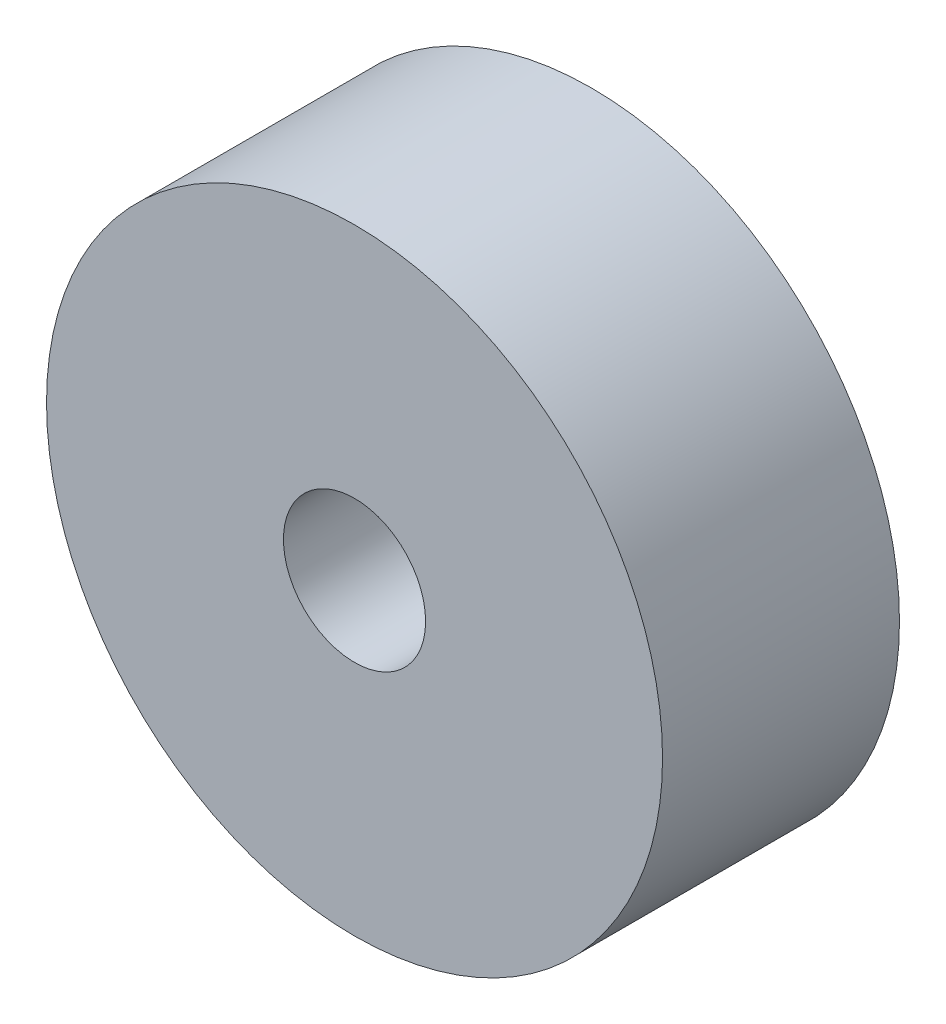
ISO-10303-21;
HEADER;
FILE_DESCRIPTION(('STEP AP214'),'2;1');
FILE_NAME('part.step','',(''),(''),'','','');
FILE_SCHEMA(('AUTOMOTIVE_DESIGN { 1 0 10303 214 1 1 1 1 }'));
ENDSEC;
DATA;
#1=APPLICATION_CONTEXT('core data for automotive mechanical design processes');
#2=APPLICATION_PROTOCOL_DEFINITION('international standard','automotive_design',2000,#1);
#3=PRODUCT_CONTEXT('',#1,'mechanical');
#4=PRODUCT('Part','Part','',(#3));
#5=PRODUCT_RELATED_PRODUCT_CATEGORY('part','',(#4));
#6=PRODUCT_DEFINITION_FORMATION('','',#4);
#7=PRODUCT_DEFINITION_CONTEXT('part definition',#1,'design');
#8=PRODUCT_DEFINITION('design','',#6,#7);
#9=PRODUCT_DEFINITION_SHAPE('','',#8);
#10=(LENGTH_UNIT() NAMED_UNIT(*) SI_UNIT(.MILLI.,.METRE.));
#11=(NAMED_UNIT(*) PLANE_ANGLE_UNIT() SI_UNIT($,.RADIAN.));
#12=(NAMED_UNIT(*) SI_UNIT($,.STERADIAN.) SOLID_ANGLE_UNIT());
#13=UNCERTAINTY_MEASURE_WITH_UNIT(LENGTH_MEASURE(1.E-05),#10,'distance_accuracy_value','');
#14=(GEOMETRIC_REPRESENTATION_CONTEXT(3) GLOBAL_UNCERTAINTY_ASSIGNED_CONTEXT((#13)) GLOBAL_UNIT_ASSIGNED_CONTEXT((#10,
#11,#12)) REPRESENTATION_CONTEXT('',''));
#15=CARTESIAN_POINT('',(0.,0.,0.));
#16=DIRECTION('',(0.,0.,1.));
#17=DIRECTION('',(1.,0.,0.));
#18=AXIS2_PLACEMENT_3D('',#15,#16,#17);
#19=CARTESIAN_POINT('',(0.,0.,20.));
#20=DIRECTION('',(0.,0.,1.));
#21=DIRECTION('',(1.,0.,0.));
#22=AXIS2_PLACEMENT_3D('',#19,#20,#21);
#23=PLANE('',#22);
#24=CARTESIAN_POINT('',(0.,0.,20.));
#25=DIRECTION('',(0.,0.,1.));
#26=DIRECTION('',(1.,0.,0.));
#27=AXIS2_PLACEMENT_3D('',#24,#25,#26);
#28=CIRCLE('',#27,26.);
#29=CARTESIAN_POINT('',(26.,0.,20.));
#30=VERTEX_POINT('',#29);
#31=EDGE_CURVE('E10',#30,#30,#28,.T.);
#32=ORIENTED_EDGE('',*,*,#31,.T.);
#33=EDGE_LOOP('',(#32));
#34=FACE_BOUND('',#33,.T.);
#35=CARTESIAN_POINT('',(0.,0.,20.));
#36=DIRECTION('',(0.,0.,1.));
#37=DIRECTION('',(1.,0.,0.));
#38=AXIS2_PLACEMENT_3D('',#35,#36,#37);
#39=CIRCLE('',#38,6.);
#40=CARTESIAN_POINT('',(6.,0.,20.));
#41=VERTEX_POINT('',#40);
#42=EDGE_CURVE('E50',#41,#41,#39,.T.);
#43=ORIENTED_EDGE('',*,*,#42,.F.);
#44=EDGE_LOOP('',(#43));
#45=FACE_BOUND('',#44,.T.);
#46=ADVANCED_FACE('F37',(#34,#45),#23,.T.);
#47=CARTESIAN_POINT('',(0.,0.,0.));
#48=DIRECTION('',(0.,0.,1.));
#49=DIRECTION('',(1.,0.,0.));
#50=AXIS2_PLACEMENT_3D('',#47,#48,#49);
#51=PLANE('',#50);
#52=CARTESIAN_POINT('',(0.,0.,0.));
#53=DIRECTION('',(0.,0.,1.));
#54=DIRECTION('',(1.,0.,0.));
#55=AXIS2_PLACEMENT_3D('',#52,#53,#54);
#56=CIRCLE('',#55,26.);
#57=CARTESIAN_POINT('',(26.,0.,0.));
#58=VERTEX_POINT('',#57);
#59=EDGE_CURVE('E41',#58,#58,#56,.T.);
#60=ORIENTED_EDGE('',*,*,#59,.F.);
#61=EDGE_LOOP('',(#60));
#62=FACE_BOUND('',#61,.T.);
#63=CARTESIAN_POINT('',(0.,0.,0.));
#64=DIRECTION('',(0.,0.,1.));
#65=DIRECTION('',(1.,0.,0.));
#66=AXIS2_PLACEMENT_3D('',#63,#64,#65);
#67=CIRCLE('',#66,6.);
#68=CARTESIAN_POINT('',(6.,0.,0.));
#69=VERTEX_POINT('',#68);
#70=EDGE_CURVE('E52',#69,#69,#67,.T.);
#71=ORIENTED_EDGE('',*,*,#70,.T.);
#72=EDGE_LOOP('',(#71));
#73=FACE_BOUND('',#72,.T.);
#74=ADVANCED_FACE('F64',(#62,#73),#51,.F.);
#75=CARTESIAN_POINT('',(0.,0.,20.));
#76=DIRECTION('',(0.,0.,-1.));
#77=DIRECTION('',(-1.,0.,0.));
#78=AXIS2_PLACEMENT_3D('',#75,#76,#77);
#79=CYLINDRICAL_SURFACE('',#78,26.);
#80=ORIENTED_EDGE('',*,*,#31,.F.);
#81=EDGE_LOOP('',(#80));
#82=FACE_BOUND('',#81,.T.);
#83=ORIENTED_EDGE('',*,*,#59,.T.);
#84=EDGE_LOOP('',(#83));
#85=FACE_BOUND('',#84,.T.);
#86=ADVANCED_FACE('F39',(#82,#85),#79,.T.);
#87=CARTESIAN_POINT('',(0.,0.,20.));
#88=DIRECTION('',(0.,0.,-1.));
#89=DIRECTION('',(-1.,0.,0.));
#90=AXIS2_PLACEMENT_3D('',#87,#88,#89);
#91=CYLINDRICAL_SURFACE('',#90,6.);
#92=ORIENTED_EDGE('',*,*,#42,.T.);
#93=EDGE_LOOP('',(#92));
#94=FACE_BOUND('',#93,.T.);
#95=ORIENTED_EDGE('',*,*,#70,.F.);
#96=EDGE_LOOP('',(#95));
#97=FACE_BOUND('',#96,.T.);
#98=ADVANCED_FACE('F60',(#94,#97),#91,.F.);
#99=CLOSED_SHELL('',(#46,#74,#86,#98));
#100=MANIFOLD_SOLID_BREP('B2',#99);
#101=ADVANCED_BREP_SHAPE_REPRESENTATION('',(#18,#100),#14);
#102=SHAPE_DEFINITION_REPRESENTATION(#9,#101);
ENDSEC;
END-ISO-10303-21;
